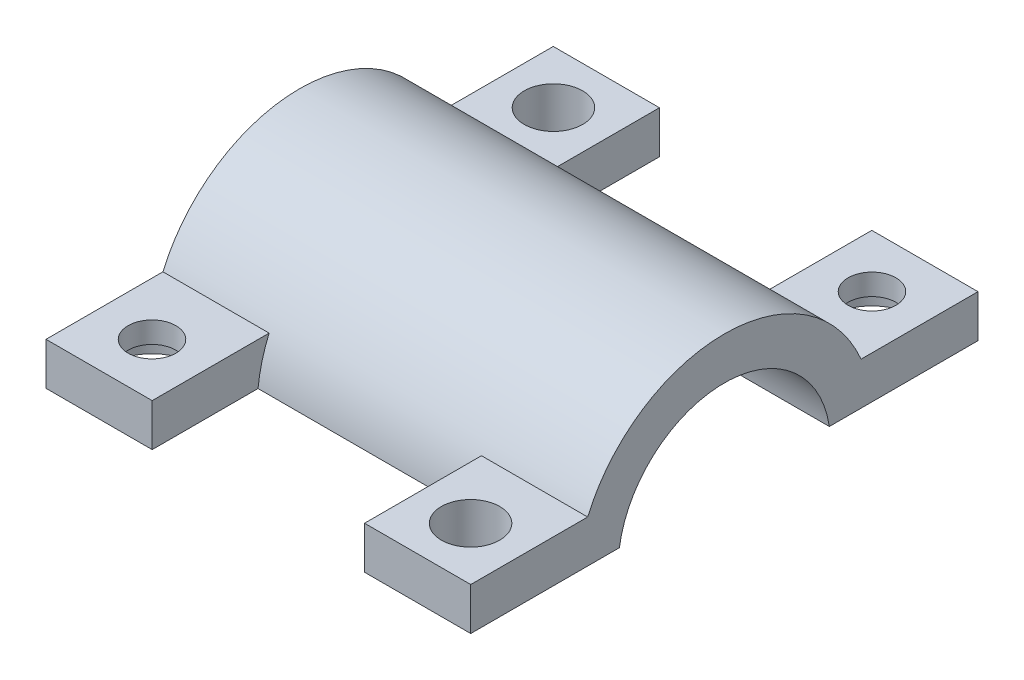
ISO-10303-21;
HEADER;
FILE_DESCRIPTION(('STEP AP214'),'2;1');
FILE_NAME('part.step','',(''),(''),'','','');
FILE_SCHEMA(('AUTOMOTIVE_DESIGN { 1 0 10303 214 1 1 1 1 }'));
ENDSEC;
DATA;
#1=APPLICATION_CONTEXT('core data for automotive mechanical design processes');
#2=APPLICATION_PROTOCOL_DEFINITION('international standard','automotive_design',2000,#1);
#3=PRODUCT_CONTEXT('',#1,'mechanical');
#4=PRODUCT('Part','Part','',(#3));
#5=PRODUCT_RELATED_PRODUCT_CATEGORY('part','',(#4));
#6=PRODUCT_DEFINITION_FORMATION('','',#4);
#7=PRODUCT_DEFINITION_CONTEXT('part definition',#1,'design');
#8=PRODUCT_DEFINITION('design','',#6,#7);
#9=PRODUCT_DEFINITION_SHAPE('','',#8);
#10=(LENGTH_UNIT() NAMED_UNIT(*) SI_UNIT(.MILLI.,.METRE.));
#11=(NAMED_UNIT(*) PLANE_ANGLE_UNIT() SI_UNIT($,.RADIAN.));
#12=(NAMED_UNIT(*) SI_UNIT($,.STERADIAN.) SOLID_ANGLE_UNIT());
#13=UNCERTAINTY_MEASURE_WITH_UNIT(LENGTH_MEASURE(1.E-05),#10,'distance_accuracy_value','');
#14=(GEOMETRIC_REPRESENTATION_CONTEXT(3) GLOBAL_UNCERTAINTY_ASSIGNED_CONTEXT((#13)) GLOBAL_UNIT_ASSIGNED_CONTEXT((#10,
#11,#12)) REPRESENTATION_CONTEXT('',''));
#15=CARTESIAN_POINT('',(0.,0.,0.));
#16=DIRECTION('',(0.,0.,1.));
#17=DIRECTION('',(1.,0.,0.));
#18=AXIS2_PLACEMENT_3D('',#15,#16,#17);
#19=CARTESIAN_POINT('',(-15.,5.5,18.9031354368588));
#20=DIRECTION('',(0.,-1.,0.));
#21=DIRECTION('',(0.,0.,-1.));
#22=AXIS2_PLACEMENT_3D('',#19,#20,#21);
#23=CYLINDRICAL_SURFACE('',#22,2.25);
#24=CARTESIAN_POINT('',(-15.,5.5,18.9031354368588));
#25=DIRECTION('',(0.,-1.,0.));
#26=DIRECTION('',(0.,0.,-1.));
#27=AXIS2_PLACEMENT_3D('',#24,#25,#26);
#28=CIRCLE('',#27,2.25);
#29=CARTESIAN_POINT('',(-15.,5.5,16.6531354368588));
#30=VERTEX_POINT('',#29);
#31=EDGE_CURVE('E200',#30,#30,#28,.T.);
#32=ORIENTED_EDGE('',*,*,#31,.F.);
#33=EDGE_LOOP('',(#32));
#34=FACE_BOUND('',#33,.T.);
#35=CARTESIAN_POINT('',(-15.,3.5,18.9031354368588));
#36=DIRECTION('',(0.,-1.,0.));
#37=DIRECTION('',(0.,0.,-1.));
#38=AXIS2_PLACEMENT_3D('',#35,#36,#37);
#39=CIRCLE('',#38,2.25);
#40=CARTESIAN_POINT('',(-15.,3.5,16.6531354368588));
#41=VERTEX_POINT('',#40);
#42=EDGE_CURVE('E43',#41,#41,#39,.F.);
#43=ORIENTED_EDGE('',*,*,#42,.F.);
#44=EDGE_LOOP('',(#43));
#45=FACE_BOUND('',#44,.T.);
#46=ADVANCED_FACE('F39',(#34,#45),#23,.F.);
#47=CARTESIAN_POINT('',(15.,5.5,-18.9031354368588));
#48=DIRECTION('',(0.,-1.,0.));
#49=DIRECTION('',(0.,0.,-1.));
#50=AXIS2_PLACEMENT_3D('',#47,#48,#49);
#51=CYLINDRICAL_SURFACE('',#50,2.25);
#52=CARTESIAN_POINT('',(15.,5.5,-18.9031354368588));
#53=DIRECTION('',(0.,-1.,0.));
#54=DIRECTION('',(0.,0.,-1.));
#55=AXIS2_PLACEMENT_3D('',#52,#53,#54);
#56=CIRCLE('',#55,2.25);
#57=CARTESIAN_POINT('',(15.,5.5,-21.1531354368588));
#58=VERTEX_POINT('',#57);
#59=EDGE_CURVE('E207',#58,#58,#56,.T.);
#60=ORIENTED_EDGE('',*,*,#59,.F.);
#61=EDGE_LOOP('',(#60));
#62=FACE_BOUND('',#61,.T.);
#63=CARTESIAN_POINT('',(15.,3.5,-18.9031354368588));
#64=DIRECTION('',(0.,-1.,0.));
#65=DIRECTION('',(0.,0.,-1.));
#66=AXIS2_PLACEMENT_3D('',#63,#64,#65);
#67=CIRCLE('',#66,2.25);
#68=CARTESIAN_POINT('',(15.,3.5,-21.1531354368588));
#69=VERTEX_POINT('',#68);
#70=EDGE_CURVE('E301',#69,#69,#67,.F.);
#71=ORIENTED_EDGE('',*,*,#70,.F.);
#72=EDGE_LOOP('',(#71));
#73=FACE_BOUND('',#72,.T.);
#74=ADVANCED_FACE('F382',(#62,#73),#51,.F.);
#75=CARTESIAN_POINT('',(20.,0.,0.));
#76=DIRECTION('',(-1.,0.,0.));
#77=DIRECTION('',(0.,0.,1.));
#78=AXIS2_PLACEMENT_3D('',#75,#76,#77);
#79=CYLINDRICAL_SURFACE('',#78,10.);
#80=CARTESIAN_POINT('',(-20.,0.,0.));
#81=DIRECTION('',(-1.,0.,0.));
#82=DIRECTION('',(0.,0.,-1.));
#83=AXIS2_PLACEMENT_3D('',#80,#81,#82);
#84=CIRCLE('',#83,10.);
#85=CARTESIAN_POINT('',(-20.,1.5,9.88685996664259));
#86=VERTEX_POINT('',#85);
#87=CARTESIAN_POINT('',(-20.,1.5,-9.88685996664259));
#88=VERTEX_POINT('',#87);
#89=EDGE_CURVE('E273',#86,#88,#84,.T.);
#90=ORIENTED_EDGE('',*,*,#89,.T.);
#91=DIRECTION('',(-1.,0.,0.));
#92=VECTOR('',#91,1.);
#93=CARTESIAN_POINT('',(20.,1.5,-9.88685996664259));
#94=LINE('',#93,#92);
#95=CARTESIAN_POINT('',(20.,1.5,-9.88685996664259));
#96=VERTEX_POINT('',#95);
#97=EDGE_CURVE('E299',#96,#88,#94,.T.);
#98=ORIENTED_EDGE('',*,*,#97,.F.);
#99=CARTESIAN_POINT('',(20.,0.,0.));
#100=DIRECTION('',(-1.,0.,0.));
#101=DIRECTION('',(0.,0.,-1.));
#102=AXIS2_PLACEMENT_3D('',#99,#100,#101);
#103=CIRCLE('',#102,10.);
#104=CARTESIAN_POINT('',(20.,1.5,9.88685996664259));
#105=VERTEX_POINT('',#104);
#106=EDGE_CURVE('E274',#105,#96,#103,.T.);
#107=ORIENTED_EDGE('',*,*,#106,.F.);
#108=DIRECTION('',(-1.,0.,0.));
#109=VECTOR('',#108,1.);
#110=CARTESIAN_POINT('',(20.,1.5,9.88685996664259));
#111=LINE('',#110,#109);
#112=EDGE_CURVE('E284',#105,#86,#111,.T.);
#113=ORIENTED_EDGE('',*,*,#112,.T.);
#114=EDGE_LOOP('',(#90,#98,#107,#113));
#115=FACE_BOUND('',#114,.T.);
#116=ADVANCED_FACE('F41',(#115),#79,.F.);
#117=CARTESIAN_POINT('',(20.,1.5,-9.88685996664259));
#118=DIRECTION('',(0.,1.,0.));
#119=DIRECTION('',(0.,0.,1.));
#120=AXIS2_PLACEMENT_3D('',#117,#118,#119);
#121=PLANE('',#120);
#122=CARTESIAN_POINT('',(15.,1.5,-18.9031354368588));
#123=DIRECTION('',(0.,-1.,0.));
#124=DIRECTION('',(0.,0.,-1.));
#125=AXIS2_PLACEMENT_3D('',#122,#123,#124);
#126=CIRCLE('',#125,4.);
#127=CARTESIAN_POINT('',(15.,1.5,-22.9031354368588));
#128=VERTEX_POINT('',#127);
#129=EDGE_CURVE('E313',#128,#128,#126,.T.);
#130=ORIENTED_EDGE('',*,*,#129,.F.);
#131=EDGE_LOOP('',(#130));
#132=FACE_BOUND('',#131,.T.);
#133=DIRECTION('',(-1.,0.,0.));
#134=VECTOR('',#133,1.);
#135=CARTESIAN_POINT('',(20.,1.5,-13.9194109070751));
#136=LINE('',#135,#134);
#137=CARTESIAN_POINT('',(10.,1.5,-13.9194109070751));
#138=VERTEX_POINT('',#137);
#139=CARTESIAN_POINT('',(-10.,1.5,-13.9194109070751));
#140=VERTEX_POINT('',#139);
#141=EDGE_CURVE('E297',#138,#140,#136,.T.);
#142=ORIENTED_EDGE('',*,*,#141,.F.);
#143=DIRECTION('',(0.,0.,-1.));
#144=VECTOR('',#143,1.);
#145=CARTESIAN_POINT('',(10.,1.5,-23.8868599666426));
#146=LINE('',#145,#144);
#147=CARTESIAN_POINT('',(10.,1.5,-23.8868599666426));
#148=VERTEX_POINT('',#147);
#149=EDGE_CURVE('E201',#138,#148,#146,.T.);
#150=ORIENTED_EDGE('',*,*,#149,.T.);
#151=DIRECTION('',(1.,0.,0.));
#152=VECTOR('',#151,1.);
#153=CARTESIAN_POINT('',(20.,1.5,-23.8868599666426));
#154=LINE('',#153,#152);
#155=CARTESIAN_POINT('',(20.,1.5,-23.8868599666426));
#156=VERTEX_POINT('',#155);
#157=EDGE_CURVE('E203',#148,#156,#154,.T.);
#158=ORIENTED_EDGE('',*,*,#157,.T.);
#159=DIRECTION('',(0.,0.,-1.));
#160=VECTOR('',#159,1.);
#161=CARTESIAN_POINT('',(20.,1.5,-9.88685996664259));
#162=LINE('',#161,#160);
#163=EDGE_CURVE('E277',#96,#156,#162,.T.);
#164=ORIENTED_EDGE('',*,*,#163,.F.);
#165=ORIENTED_EDGE('',*,*,#97,.T.);
#166=DIRECTION('',(0.,0.,-1.));
#167=VECTOR('',#166,1.);
#168=CARTESIAN_POINT('',(-20.,1.5,-9.88685996664259));
#169=LINE('',#168,#167);
#170=CARTESIAN_POINT('',(-20.,1.5,-23.8868599666426));
#171=VERTEX_POINT('',#170);
#172=EDGE_CURVE('E287',#88,#171,#169,.T.);
#173=ORIENTED_EDGE('',*,*,#172,.T.);
#174=DIRECTION('',(1.,0.,0.));
#175=VECTOR('',#174,1.);
#176=CARTESIAN_POINT('',(-20.,1.5,-23.8868599666426));
#177=LINE('',#176,#175);
#178=CARTESIAN_POINT('',(-10.,1.5,-23.8868599666426));
#179=VERTEX_POINT('',#178);
#180=EDGE_CURVE('E240',#171,#179,#177,.T.);
#181=ORIENTED_EDGE('',*,*,#180,.T.);
#182=DIRECTION('',(0.,0.,1.));
#183=VECTOR('',#182,1.);
#184=CARTESIAN_POINT('',(-10.,1.5,-23.8868599666426));
#185=LINE('',#184,#183);
#186=EDGE_CURVE('E246',#179,#140,#185,.T.);
#187=ORIENTED_EDGE('',*,*,#186,.T.);
#188=EDGE_LOOP('',(#142,#150,#158,#164,#165,#173,#181,#187));
#189=FACE_BOUND('',#188,.T.);
#190=CARTESIAN_POINT('',(-15.,1.5,-18.9031354368588));
#191=DIRECTION('',(0.,-1.,0.));
#192=DIRECTION('',(0.,0.,-1.));
#193=AXIS2_PLACEMENT_3D('',#190,#191,#192);
#194=CIRCLE('',#193,2.75);
#195=CARTESIAN_POINT('',(-15.,1.5,-21.6531354368588));
#196=VERTEX_POINT('',#195);
#197=EDGE_CURVE('E216',#196,#196,#194,.T.);
#198=ORIENTED_EDGE('',*,*,#197,.F.);
#199=EDGE_LOOP('',(#198));
#200=FACE_BOUND('',#199,.T.);
#201=ADVANCED_FACE('F362',(#132,#189,#200),#121,.F.);
#202=CARTESIAN_POINT('',(20.,0.,0.));
#203=DIRECTION('',(-1.,0.,0.));
#204=DIRECTION('',(0.,0.,1.));
#205=AXIS2_PLACEMENT_3D('',#202,#203,#204);
#206=CYLINDRICAL_SURFACE('',#205,14.);
#207=DIRECTION('',(-1.,0.,0.));
#208=VECTOR('',#207,1.);
#209=CARTESIAN_POINT('',(20.,5.5,-12.8743931895837));
#210=LINE('',#209,#208);
#211=CARTESIAN_POINT('',(20.,5.5,-12.8743931895837));
#212=VERTEX_POINT('',#211);
#213=CARTESIAN_POINT('',(10.,5.5,-12.8743931895837));
#214=VERTEX_POINT('',#213);
#215=EDGE_CURVE('E55',#212,#214,#210,.T.);
#216=ORIENTED_EDGE('',*,*,#215,.T.);
#217=CARTESIAN_POINT('',(10.,0.,0.));
#218=DIRECTION('',(-1.,0.,0.));
#219=DIRECTION('',(0.,0.,1.));
#220=AXIS2_PLACEMENT_3D('',#217,#218,#219);
#221=CIRCLE('',#220,14.);
#222=EDGE_CURVE('E11',#214,#138,#221,.T.);
#223=ORIENTED_EDGE('',*,*,#222,.T.);
#224=ORIENTED_EDGE('',*,*,#141,.T.);
#225=CARTESIAN_POINT('',(-10.,0.,0.));
#226=DIRECTION('',(1.,0.,0.));
#227=DIRECTION('',(0.,0.,-1.));
#228=AXIS2_PLACEMENT_3D('',#225,#226,#227);
#229=CIRCLE('',#228,14.);
#230=CARTESIAN_POINT('',(-10.,5.5,-12.8743931895837));
#231=VERTEX_POINT('',#230);
#232=EDGE_CURVE('E48',#140,#231,#229,.T.);
#233=ORIENTED_EDGE('',*,*,#232,.T.);
#234=DIRECTION('',(-1.,0.,0.));
#235=VECTOR('',#234,1.);
#236=CARTESIAN_POINT('',(20.,5.5,-12.8743931895837));
#237=LINE('',#236,#235);
#238=CARTESIAN_POINT('',(-20.,5.5,-12.8743931895837));
#239=VERTEX_POINT('',#238);
#240=EDGE_CURVE('E259',#239,#231,#237,.F.);
#241=ORIENTED_EDGE('',*,*,#240,.F.);
#242=CARTESIAN_POINT('',(-20.,0.,0.));
#243=DIRECTION('',(1.,0.,0.));
#244=DIRECTION('',(0.,0.,1.));
#245=AXIS2_PLACEMENT_3D('',#242,#243,#244);
#246=CIRCLE('',#245,14.);
#247=CARTESIAN_POINT('',(-20.,5.5,12.8743931895837));
#248=VERTEX_POINT('',#247);
#249=EDGE_CURVE('E289',#239,#248,#246,.T.);
#250=ORIENTED_EDGE('',*,*,#249,.T.);
#251=DIRECTION('',(-1.,0.,0.));
#252=VECTOR('',#251,1.);
#253=CARTESIAN_POINT('',(20.,5.5,12.8743931895837));
#254=LINE('',#253,#252);
#255=CARTESIAN_POINT('',(-10.,5.5,12.8743931895837));
#256=VERTEX_POINT('',#255);
#257=EDGE_CURVE('E263',#248,#256,#254,.F.);
#258=ORIENTED_EDGE('',*,*,#257,.T.);
#259=CARTESIAN_POINT('',(-10.,0.,0.));
#260=DIRECTION('',(1.,0.,0.));
#261=DIRECTION('',(0.,0.,-1.));
#262=AXIS2_PLACEMENT_3D('',#259,#260,#261);
#263=CIRCLE('',#262,14.);
#264=CARTESIAN_POINT('',(-10.,1.5,13.9194109070751));
#265=VERTEX_POINT('',#264);
#266=EDGE_CURVE('E270',#256,#265,#263,.T.);
#267=ORIENTED_EDGE('',*,*,#266,.T.);
#268=DIRECTION('',(-1.,0.,0.));
#269=VECTOR('',#268,1.);
#270=CARTESIAN_POINT('',(20.,1.5,13.9194109070751));
#271=LINE('',#270,#269);
#272=CARTESIAN_POINT('',(10.,1.5,13.9194109070751));
#273=VERTEX_POINT('',#272);
#274=EDGE_CURVE('E295',#273,#265,#271,.T.);
#275=ORIENTED_EDGE('',*,*,#274,.F.);
#276=CARTESIAN_POINT('',(10.,0.,0.));
#277=DIRECTION('',(-1.,0.,0.));
#278=DIRECTION('',(0.,0.,1.));
#279=AXIS2_PLACEMENT_3D('',#276,#277,#278);
#280=CIRCLE('',#279,14.);
#281=CARTESIAN_POINT('',(10.,5.5,12.8743931895837));
#282=VERTEX_POINT('',#281);
#283=EDGE_CURVE('E169',#273,#282,#280,.T.);
#284=ORIENTED_EDGE('',*,*,#283,.T.);
#285=DIRECTION('',(-1.,0.,0.));
#286=VECTOR('',#285,1.);
#287=CARTESIAN_POINT('',(20.,5.5,12.8743931895837));
#288=LINE('',#287,#286);
#289=CARTESIAN_POINT('',(20.,5.5,12.8743931895837));
#290=VERTEX_POINT('',#289);
#291=EDGE_CURVE('E266',#290,#282,#288,.T.);
#292=ORIENTED_EDGE('',*,*,#291,.F.);
#293=CARTESIAN_POINT('',(20.,0.,0.));
#294=DIRECTION('',(1.,0.,0.));
#295=DIRECTION('',(0.,0.,1.));
#296=AXIS2_PLACEMENT_3D('',#293,#294,#295);
#297=CIRCLE('',#296,14.);
#298=EDGE_CURVE('E280',#212,#290,#297,.T.);
#299=ORIENTED_EDGE('',*,*,#298,.F.);
#300=EDGE_LOOP('',(#216,#223,#224,#233,#241,#250,#258,#267,#275,#284,#292,#299));
#301=FACE_BOUND('',#300,.T.);
#302=ADVANCED_FACE('F326',(#301),#206,.T.);
#303=CARTESIAN_POINT('',(20.,1.5,13.9194109070751));
#304=DIRECTION('',(0.,1.,0.));
#305=DIRECTION('',(0.,0.,1.));
#306=AXIS2_PLACEMENT_3D('',#303,#304,#305);
#307=PLANE('',#306);
#308=CARTESIAN_POINT('',(-15.,1.5,18.9031354368588));
#309=DIRECTION('',(0.,-1.,0.));
#310=DIRECTION('',(0.,0.,-1.));
#311=AXIS2_PLACEMENT_3D('',#308,#309,#310);
#312=CIRCLE('',#311,4.);
#313=CARTESIAN_POINT('',(-15.,1.5,14.9031354368588));
#314=VERTEX_POINT('',#313);
#315=EDGE_CURVE('E308',#314,#314,#312,.T.);
#316=ORIENTED_EDGE('',*,*,#315,.F.);
#317=EDGE_LOOP('',(#316));
#318=FACE_BOUND('',#317,.T.);
#319=ORIENTED_EDGE('',*,*,#274,.T.);
#320=DIRECTION('',(0.,0.,1.));
#321=VECTOR('',#320,1.);
#322=CARTESIAN_POINT('',(-10.,1.5,23.8868599666426));
#323=LINE('',#322,#321);
#324=CARTESIAN_POINT('',(-10.,1.5,23.8868599666426));
#325=VERTEX_POINT('',#324);
#326=EDGE_CURVE('E223',#265,#325,#323,.T.);
#327=ORIENTED_EDGE('',*,*,#326,.T.);
#328=DIRECTION('',(-1.,0.,0.));
#329=VECTOR('',#328,1.);
#330=CARTESIAN_POINT('',(-20.,1.5,23.8868599666426));
#331=LINE('',#330,#329);
#332=CARTESIAN_POINT('',(-20.,1.5,23.8868599666426));
#333=VERTEX_POINT('',#332);
#334=EDGE_CURVE('E225',#325,#333,#331,.T.);
#335=ORIENTED_EDGE('',*,*,#334,.T.);
#336=DIRECTION('',(0.,0.,-1.));
#337=VECTOR('',#336,1.);
#338=CARTESIAN_POINT('',(-20.,1.5,13.9194109070751));
#339=LINE('',#338,#337);
#340=EDGE_CURVE('E278',#333,#86,#339,.T.);
#341=ORIENTED_EDGE('',*,*,#340,.T.);
#342=ORIENTED_EDGE('',*,*,#112,.F.);
#343=DIRECTION('',(0.,0.,-1.));
#344=VECTOR('',#343,1.);
#345=CARTESIAN_POINT('',(20.,1.5,13.9194109070751));
#346=LINE('',#345,#344);
#347=CARTESIAN_POINT('',(20.,1.5,23.8868599666426));
#348=VERTEX_POINT('',#347);
#349=EDGE_CURVE('E178',#348,#105,#346,.T.);
#350=ORIENTED_EDGE('',*,*,#349,.F.);
#351=DIRECTION('',(-1.,0.,0.));
#352=VECTOR('',#351,1.);
#353=CARTESIAN_POINT('',(20.,1.5,23.8868599666426));
#354=LINE('',#353,#352);
#355=CARTESIAN_POINT('',(10.,1.5,23.8868599666426));
#356=VERTEX_POINT('',#355);
#357=EDGE_CURVE('E157',#348,#356,#354,.T.);
#358=ORIENTED_EDGE('',*,*,#357,.T.);
#359=DIRECTION('',(0.,0.,-1.));
#360=VECTOR('',#359,1.);
#361=CARTESIAN_POINT('',(10.,1.5,23.8868599666426));
#362=LINE('',#361,#360);
#363=EDGE_CURVE('E166',#356,#273,#362,.T.);
#364=ORIENTED_EDGE('',*,*,#363,.T.);
#365=EDGE_LOOP('',(#319,#327,#335,#341,#342,#350,#358,#364));
#366=FACE_BOUND('',#365,.T.);
#367=CARTESIAN_POINT('',(15.,1.5,18.9031354368588));
#368=DIRECTION('',(0.,-1.,0.));
#369=DIRECTION('',(0.,0.,-1.));
#370=AXIS2_PLACEMENT_3D('',#367,#368,#369);
#371=CIRCLE('',#370,2.75);
#372=CARTESIAN_POINT('',(15.,1.5,16.1531354368588));
#373=VERTEX_POINT('',#372);
#374=EDGE_CURVE('E183',#373,#373,#371,.T.);
#375=ORIENTED_EDGE('',*,*,#374,.F.);
#376=EDGE_LOOP('',(#375));
#377=FACE_BOUND('',#376,.T.);
#378=ADVANCED_FACE('F175',(#318,#366,#377),#307,.F.);
#379=CARTESIAN_POINT('',(20.,0.,0.));
#380=DIRECTION('',(1.,0.,0.));
#381=DIRECTION('',(0.,0.,-1.));
#382=AXIS2_PLACEMENT_3D('',#379,#380,#381);
#383=PLANE('',#382);
#384=ORIENTED_EDGE('',*,*,#106,.T.);
#385=ORIENTED_EDGE('',*,*,#163,.T.);
#386=DIRECTION('',(0.,-1.,0.));
#387=VECTOR('',#386,1.);
#388=CARTESIAN_POINT('',(20.,5.5,-23.8868599666426));
#389=LINE('',#388,#387);
#390=CARTESIAN_POINT('',(20.,5.5,-23.8868599666426));
#391=VERTEX_POINT('',#390);
#392=EDGE_CURVE('E193',#391,#156,#389,.T.);
#393=ORIENTED_EDGE('',*,*,#392,.F.);
#394=DIRECTION('',(0.,0.,1.));
#395=VECTOR('',#394,1.);
#396=CARTESIAN_POINT('',(20.,5.5,-9.88685996664259));
#397=LINE('',#396,#395);
#398=EDGE_CURVE('E209',#391,#212,#397,.T.);
#399=ORIENTED_EDGE('',*,*,#398,.T.);
#400=ORIENTED_EDGE('',*,*,#298,.T.);
#401=DIRECTION('',(0.,0.,1.));
#402=VECTOR('',#401,1.);
#403=CARTESIAN_POINT('',(20.,5.5,9.88685996664259));
#404=LINE('',#403,#402);
#405=CARTESIAN_POINT('',(20.,5.5,23.8868599666426));
#406=VERTEX_POINT('',#405);
#407=EDGE_CURVE('E173',#290,#406,#404,.T.);
#408=ORIENTED_EDGE('',*,*,#407,.T.);
#409=DIRECTION('',(0.,-1.,0.));
#410=VECTOR('',#409,1.);
#411=CARTESIAN_POINT('',(20.,5.5,23.8868599666426));
#412=LINE('',#411,#410);
#413=EDGE_CURVE('E163',#406,#348,#412,.T.);
#414=ORIENTED_EDGE('',*,*,#413,.T.);
#415=ORIENTED_EDGE('',*,*,#349,.T.);
#416=EDGE_LOOP('',(#384,#385,#393,#399,#400,#408,#414,#415));
#417=FACE_BOUND('',#416,.T.);
#418=ADVANCED_FACE('F322',(#417),#383,.T.);
#419=CARTESIAN_POINT('',(-20.,0.,0.));
#420=DIRECTION('',(1.,0.,0.));
#421=DIRECTION('',(0.,0.,-1.));
#422=AXIS2_PLACEMENT_3D('',#419,#420,#421);
#423=PLANE('',#422);
#424=ORIENTED_EDGE('',*,*,#172,.F.);
#425=ORIENTED_EDGE('',*,*,#89,.F.);
#426=ORIENTED_EDGE('',*,*,#340,.F.);
#427=DIRECTION('',(0.,-1.,0.));
#428=VECTOR('',#427,1.);
#429=CARTESIAN_POINT('',(-20.,5.5,23.8868599666426));
#430=LINE('',#429,#428);
#431=CARTESIAN_POINT('',(-20.,5.5,23.8868599666426));
#432=VERTEX_POINT('',#431);
#433=EDGE_CURVE('E217',#432,#333,#430,.T.);
#434=ORIENTED_EDGE('',*,*,#433,.F.);
#435=DIRECTION('',(0.,0.,-1.));
#436=VECTOR('',#435,1.);
#437=CARTESIAN_POINT('',(-20.,5.5,9.88685996664259));
#438=LINE('',#437,#436);
#439=EDGE_CURVE('E230',#432,#248,#438,.T.);
#440=ORIENTED_EDGE('',*,*,#439,.T.);
#441=ORIENTED_EDGE('',*,*,#249,.F.);
#442=DIRECTION('',(0.,0.,-1.));
#443=VECTOR('',#442,1.);
#444=CARTESIAN_POINT('',(-20.,5.5,-9.88685996664259));
#445=LINE('',#444,#443);
#446=CARTESIAN_POINT('',(-20.,5.5,-23.8868599666426));
#447=VERTEX_POINT('',#446);
#448=EDGE_CURVE('E243',#239,#447,#445,.T.);
#449=ORIENTED_EDGE('',*,*,#448,.T.);
#450=DIRECTION('',(0.,-1.,0.));
#451=VECTOR('',#450,1.);
#452=CARTESIAN_POINT('',(-20.,5.5,-23.8868599666426));
#453=LINE('',#452,#451);
#454=EDGE_CURVE('E252',#447,#171,#453,.T.);
#455=ORIENTED_EDGE('',*,*,#454,.T.);
#456=EDGE_LOOP('',(#424,#425,#426,#434,#440,#441,#449,#455));
#457=FACE_BOUND('',#456,.T.);
#458=ADVANCED_FACE('F338',(#457),#423,.F.);
#459=CARTESIAN_POINT('',(0.,5.5,0.));
#460=DIRECTION('',(0.,-1.,0.));
#461=DIRECTION('',(0.,0.,-1.));
#462=AXIS2_PLACEMENT_3D('',#459,#460,#461);
#463=PLANE('',#462);
#464=CARTESIAN_POINT('',(-15.,5.5,-18.9031354368588));
#465=DIRECTION('',(0.,-1.,0.));
#466=DIRECTION('',(0.,0.,-1.));
#467=AXIS2_PLACEMENT_3D('',#464,#465,#466);
#468=CIRCLE('',#467,2.75);
#469=CARTESIAN_POINT('',(-15.,5.5,-21.6531354368588));
#470=VERTEX_POINT('',#469);
#471=EDGE_CURVE('E237',#470,#470,#468,.T.);
#472=ORIENTED_EDGE('',*,*,#471,.T.);
#473=EDGE_LOOP('',(#472));
#474=FACE_BOUND('',#473,.T.);
#475=ORIENTED_EDGE('',*,*,#448,.F.);
#476=ORIENTED_EDGE('',*,*,#240,.T.);
#477=DIRECTION('',(0.,0.,1.));
#478=VECTOR('',#477,1.);
#479=CARTESIAN_POINT('',(-10.,5.5,-23.8868599666426));
#480=LINE('',#479,#478);
#481=CARTESIAN_POINT('',(-10.,5.5,-23.8868599666426));
#482=VERTEX_POINT('',#481);
#483=EDGE_CURVE('E249',#482,#231,#480,.T.);
#484=ORIENTED_EDGE('',*,*,#483,.F.);
#485=DIRECTION('',(1.,0.,0.));
#486=VECTOR('',#485,1.);
#487=CARTESIAN_POINT('',(-20.,5.5,-23.8868599666426));
#488=LINE('',#487,#486);
#489=EDGE_CURVE('E245',#447,#482,#488,.T.);
#490=ORIENTED_EDGE('',*,*,#489,.F.);
#491=EDGE_LOOP('',(#475,#476,#484,#490));
#492=FACE_BOUND('',#491,.T.);
#493=ADVANCED_FACE('F347',(#474,#492),#463,.F.);
#494=CARTESIAN_POINT('',(-10.,5.5,-23.8868599666426));
#495=DIRECTION('',(1.,0.,0.));
#496=DIRECTION('',(0.,0.,-1.));
#497=AXIS2_PLACEMENT_3D('',#494,#495,#496);
#498=PLANE('',#497);
#499=ORIENTED_EDGE('',*,*,#232,.F.);
#500=ORIENTED_EDGE('',*,*,#186,.F.);
#501=DIRECTION('',(0.,-1.,0.));
#502=VECTOR('',#501,1.);
#503=CARTESIAN_POINT('',(-10.,5.5,-23.8868599666426));
#504=LINE('',#503,#502);
#505=EDGE_CURVE('E257',#482,#179,#504,.T.);
#506=ORIENTED_EDGE('',*,*,#505,.F.);
#507=ORIENTED_EDGE('',*,*,#483,.T.);
#508=EDGE_LOOP('',(#499,#500,#506,#507));
#509=FACE_BOUND('',#508,.T.);
#510=ADVANCED_FACE('F401',(#509),#498,.T.);
#511=CARTESIAN_POINT('',(-20.,5.5,-23.8868599666426));
#512=DIRECTION('',(0.,0.,-1.));
#513=DIRECTION('',(-1.,0.,0.));
#514=AXIS2_PLACEMENT_3D('',#511,#512,#513);
#515=PLANE('',#514);
#516=ORIENTED_EDGE('',*,*,#180,.F.);
#517=ORIENTED_EDGE('',*,*,#454,.F.);
#518=ORIENTED_EDGE('',*,*,#489,.T.);
#519=ORIENTED_EDGE('',*,*,#505,.T.);
#520=EDGE_LOOP('',(#516,#517,#518,#519));
#521=FACE_BOUND('',#520,.T.);
#522=ADVANCED_FACE('F351',(#521),#515,.T.);
#523=CARTESIAN_POINT('',(-15.,5.5,-18.9031354368588));
#524=DIRECTION('',(0.,-1.,0.));
#525=DIRECTION('',(0.,0.,-1.));
#526=AXIS2_PLACEMENT_3D('',#523,#524,#525);
#527=CYLINDRICAL_SURFACE('',#526,2.75);
#528=ORIENTED_EDGE('',*,*,#471,.F.);
#529=EDGE_LOOP('',(#528));
#530=FACE_BOUND('',#529,.T.);
#531=ORIENTED_EDGE('',*,*,#197,.T.);
#532=EDGE_LOOP('',(#531));
#533=FACE_BOUND('',#532,.T.);
#534=ADVANCED_FACE('F395',(#530,#533),#527,.F.);
#535=CARTESIAN_POINT('',(10.,5.5,23.8868599666426));
#536=DIRECTION('',(-1.,0.,0.));
#537=DIRECTION('',(0.,0.,1.));
#538=AXIS2_PLACEMENT_3D('',#535,#536,#537);
#539=PLANE('',#538);
#540=ORIENTED_EDGE('',*,*,#283,.F.);
#541=ORIENTED_EDGE('',*,*,#363,.F.);
#542=DIRECTION('',(0.,-1.,0.));
#543=VECTOR('',#542,1.);
#544=CARTESIAN_POINT('',(10.,5.5,23.8868599666426));
#545=LINE('',#544,#543);
#546=CARTESIAN_POINT('',(10.,5.5,23.8868599666426));
#547=VERTEX_POINT('',#546);
#548=EDGE_CURVE('E152',#547,#356,#545,.T.);
#549=ORIENTED_EDGE('',*,*,#548,.F.);
#550=DIRECTION('',(0.,0.,-1.));
#551=VECTOR('',#550,1.);
#552=CARTESIAN_POINT('',(10.,5.5,23.8868599666426));
#553=LINE('',#552,#551);
#554=EDGE_CURVE('E186',#547,#282,#553,.T.);
#555=ORIENTED_EDGE('',*,*,#554,.T.);
#556=EDGE_LOOP('',(#540,#541,#549,#555));
#557=FACE_BOUND('',#556,.T.);
#558=ADVANCED_FACE('F167',(#557),#539,.T.);
#559=CARTESIAN_POINT('',(0.,5.5,0.));
#560=DIRECTION('',(0.,-1.,0.));
#561=DIRECTION('',(0.,0.,-1.));
#562=AXIS2_PLACEMENT_3D('',#559,#560,#561);
#563=PLANE('',#562);
#564=CARTESIAN_POINT('',(15.,5.5,18.9031354368588));
#565=DIRECTION('',(0.,-1.,0.));
#566=DIRECTION('',(0.,0.,-1.));
#567=AXIS2_PLACEMENT_3D('',#564,#565,#566);
#568=CIRCLE('',#567,2.75);
#569=CARTESIAN_POINT('',(15.,5.5,16.1531354368588));
#570=VERTEX_POINT('',#569);
#571=EDGE_CURVE('E180',#570,#570,#568,.T.);
#572=ORIENTED_EDGE('',*,*,#571,.T.);
#573=EDGE_LOOP('',(#572));
#574=FACE_BOUND('',#573,.T.);
#575=ORIENTED_EDGE('',*,*,#407,.F.);
#576=ORIENTED_EDGE('',*,*,#291,.T.);
#577=ORIENTED_EDGE('',*,*,#554,.F.);
#578=DIRECTION('',(-1.,0.,0.));
#579=VECTOR('',#578,1.);
#580=CARTESIAN_POINT('',(20.,5.5,23.8868599666426));
#581=LINE('',#580,#579);
#582=EDGE_CURVE('E159',#406,#547,#581,.T.);
#583=ORIENTED_EDGE('',*,*,#582,.F.);
#584=EDGE_LOOP('',(#575,#576,#577,#583));
#585=FACE_BOUND('',#584,.T.);
#586=ADVANCED_FACE('F324',(#574,#585),#563,.F.);
#587=CARTESIAN_POINT('',(20.,5.5,23.8868599666426));
#588=DIRECTION('',(0.,0.,1.));
#589=DIRECTION('',(1.,0.,0.));
#590=AXIS2_PLACEMENT_3D('',#587,#588,#589);
#591=PLANE('',#590);
#592=ORIENTED_EDGE('',*,*,#357,.F.);
#593=ORIENTED_EDGE('',*,*,#413,.F.);
#594=ORIENTED_EDGE('',*,*,#582,.T.);
#595=ORIENTED_EDGE('',*,*,#548,.T.);
#596=EDGE_LOOP('',(#592,#593,#594,#595));
#597=FACE_BOUND('',#596,.T.);
#598=ADVANCED_FACE('F154',(#597),#591,.T.);
#599=CARTESIAN_POINT('',(15.,5.5,18.9031354368588));
#600=DIRECTION('',(0.,-1.,0.));
#601=DIRECTION('',(0.,0.,-1.));
#602=AXIS2_PLACEMENT_3D('',#599,#600,#601);
#603=CYLINDRICAL_SURFACE('',#602,2.75);
#604=ORIENTED_EDGE('',*,*,#571,.F.);
#605=EDGE_LOOP('',(#604));
#606=FACE_BOUND('',#605,.T.);
#607=ORIENTED_EDGE('',*,*,#374,.T.);
#608=EDGE_LOOP('',(#607));
#609=FACE_BOUND('',#608,.T.);
#610=ADVANCED_FACE('F442',(#606,#609),#603,.F.);
#611=CARTESIAN_POINT('',(-10.,5.5,23.8868599666426));
#612=DIRECTION('',(1.,0.,0.));
#613=DIRECTION('',(0.,0.,-1.));
#614=AXIS2_PLACEMENT_3D('',#611,#612,#613);
#615=PLANE('',#614);
#616=ORIENTED_EDGE('',*,*,#266,.F.);
#617=DIRECTION('',(0.,0.,1.));
#618=VECTOR('',#617,1.);
#619=CARTESIAN_POINT('',(-10.,5.5,23.8868599666426));
#620=LINE('',#619,#618);
#621=CARTESIAN_POINT('',(-10.,5.5,23.8868599666426));
#622=VERTEX_POINT('',#621);
#623=EDGE_CURVE('E220',#256,#622,#620,.T.);
#624=ORIENTED_EDGE('',*,*,#623,.T.);
#625=DIRECTION('',(0.,-1.,0.));
#626=VECTOR('',#625,1.);
#627=CARTESIAN_POINT('',(-10.,5.5,23.8868599666426));
#628=LINE('',#627,#626);
#629=EDGE_CURVE('E191',#622,#325,#628,.T.);
#630=ORIENTED_EDGE('',*,*,#629,.T.);
#631=ORIENTED_EDGE('',*,*,#326,.F.);
#632=EDGE_LOOP('',(#616,#624,#630,#631));
#633=FACE_BOUND('',#632,.T.);
#634=ADVANCED_FACE('F330',(#633),#615,.T.);
#635=CARTESIAN_POINT('',(0.,5.5,0.));
#636=DIRECTION('',(0.,1.,0.));
#637=DIRECTION('',(0.,0.,1.));
#638=AXIS2_PLACEMENT_3D('',#635,#636,#637);
#639=PLANE('',#638);
#640=ORIENTED_EDGE('',*,*,#31,.T.);
#641=EDGE_LOOP('',(#640));
#642=FACE_BOUND('',#641,.T.);
#643=ORIENTED_EDGE('',*,*,#257,.F.);
#644=ORIENTED_EDGE('',*,*,#439,.F.);
#645=DIRECTION('',(-1.,0.,0.));
#646=VECTOR('',#645,1.);
#647=CARTESIAN_POINT('',(-20.,5.5,23.8868599666426));
#648=LINE('',#647,#646);
#649=EDGE_CURVE('E226',#622,#432,#648,.T.);
#650=ORIENTED_EDGE('',*,*,#649,.F.);
#651=ORIENTED_EDGE('',*,*,#623,.F.);
#652=EDGE_LOOP('',(#643,#644,#650,#651));
#653=FACE_BOUND('',#652,.T.);
#654=ADVANCED_FACE('F342',(#642,#653),#639,.T.);
#655=CARTESIAN_POINT('',(-20.,5.5,23.8868599666426));
#656=DIRECTION('',(0.,0.,1.));
#657=DIRECTION('',(1.,0.,0.));
#658=AXIS2_PLACEMENT_3D('',#655,#656,#657);
#659=PLANE('',#658);
#660=ORIENTED_EDGE('',*,*,#334,.F.);
#661=ORIENTED_EDGE('',*,*,#629,.F.);
#662=ORIENTED_EDGE('',*,*,#649,.T.);
#663=ORIENTED_EDGE('',*,*,#433,.T.);
#664=EDGE_LOOP('',(#660,#661,#662,#663));
#665=FACE_BOUND('',#664,.T.);
#666=ADVANCED_FACE('F334',(#665),#659,.T.);
#667=CARTESIAN_POINT('',(0.,5.5,0.));
#668=DIRECTION('',(0.,1.,0.));
#669=DIRECTION('',(0.,0.,1.));
#670=AXIS2_PLACEMENT_3D('',#667,#668,#669);
#671=PLANE('',#670);
#672=ORIENTED_EDGE('',*,*,#59,.T.);
#673=EDGE_LOOP('',(#672));
#674=FACE_BOUND('',#673,.T.);
#675=ORIENTED_EDGE('',*,*,#215,.F.);
#676=ORIENTED_EDGE('',*,*,#398,.F.);
#677=DIRECTION('',(1.,0.,0.));
#678=VECTOR('',#677,1.);
#679=CARTESIAN_POINT('',(20.,5.5,-23.8868599666426));
#680=LINE('',#679,#678);
#681=CARTESIAN_POINT('',(10.,5.5,-23.8868599666426));
#682=VERTEX_POINT('',#681);
#683=EDGE_CURVE('E204',#682,#391,#680,.T.);
#684=ORIENTED_EDGE('',*,*,#683,.F.);
#685=DIRECTION('',(0.,0.,-1.));
#686=VECTOR('',#685,1.);
#687=CARTESIAN_POINT('',(10.,5.5,-23.8868599666426));
#688=LINE('',#687,#686);
#689=EDGE_CURVE('E196',#214,#682,#688,.T.);
#690=ORIENTED_EDGE('',*,*,#689,.F.);
#691=EDGE_LOOP('',(#675,#676,#684,#690));
#692=FACE_BOUND('',#691,.T.);
#693=ADVANCED_FACE('F369',(#674,#692),#671,.T.);
#694=CARTESIAN_POINT('',(20.,5.5,-23.8868599666426));
#695=DIRECTION('',(0.,0.,-1.));
#696=DIRECTION('',(-1.,0.,0.));
#697=AXIS2_PLACEMENT_3D('',#694,#695,#696);
#698=PLANE('',#697);
#699=ORIENTED_EDGE('',*,*,#157,.F.);
#700=DIRECTION('',(0.,-1.,0.));
#701=VECTOR('',#700,1.);
#702=CARTESIAN_POINT('',(10.,5.5,-23.8868599666426));
#703=LINE('',#702,#701);
#704=EDGE_CURVE('E197',#682,#148,#703,.T.);
#705=ORIENTED_EDGE('',*,*,#704,.F.);
#706=ORIENTED_EDGE('',*,*,#683,.T.);
#707=ORIENTED_EDGE('',*,*,#392,.T.);
#708=EDGE_LOOP('',(#699,#705,#706,#707));
#709=FACE_BOUND('',#708,.T.);
#710=ADVANCED_FACE('F359',(#709),#698,.T.);
#711=CARTESIAN_POINT('',(10.,5.5,-23.8868599666426));
#712=DIRECTION('',(-1.,0.,0.));
#713=DIRECTION('',(0.,0.,1.));
#714=AXIS2_PLACEMENT_3D('',#711,#712,#713);
#715=PLANE('',#714);
#716=ORIENTED_EDGE('',*,*,#222,.F.);
#717=ORIENTED_EDGE('',*,*,#689,.T.);
#718=ORIENTED_EDGE('',*,*,#704,.T.);
#719=ORIENTED_EDGE('',*,*,#149,.F.);
#720=EDGE_LOOP('',(#716,#717,#718,#719));
#721=FACE_BOUND('',#720,.T.);
#722=ADVANCED_FACE('F366',(#721),#715,.T.);
#723=CARTESIAN_POINT('',(15.,3.5,-18.9031354368588));
#724=DIRECTION('',(0.,-1.,0.));
#725=DIRECTION('',(0.,0.,-1.));
#726=AXIS2_PLACEMENT_3D('',#723,#724,#725);
#727=PLANE('',#726);
#728=CARTESIAN_POINT('',(15.,3.5,-18.9031354368588));
#729=DIRECTION('',(0.,-1.,0.));
#730=DIRECTION('',(0.,0.,-1.));
#731=AXIS2_PLACEMENT_3D('',#728,#729,#730);
#732=CIRCLE('',#731,4.);
#733=CARTESIAN_POINT('',(15.,3.5,-22.9031354368588));
#734=VERTEX_POINT('',#733);
#735=EDGE_CURVE('E318',#734,#734,#732,.T.);
#736=ORIENTED_EDGE('',*,*,#735,.T.);
#737=EDGE_LOOP('',(#736));
#738=FACE_BOUND('',#737,.T.);
#739=ORIENTED_EDGE('',*,*,#70,.T.);
#740=EDGE_LOOP('',(#739));
#741=FACE_BOUND('',#740,.T.);
#742=ADVANCED_FACE('F426',(#738,#741),#727,.T.);
#743=CARTESIAN_POINT('',(15.,3.5,-18.9031354368588));
#744=DIRECTION('',(0.,-1.,0.));
#745=DIRECTION('',(0.,0.,-1.));
#746=AXIS2_PLACEMENT_3D('',#743,#744,#745);
#747=CYLINDRICAL_SURFACE('',#746,4.);
#748=ORIENTED_EDGE('',*,*,#735,.F.);
#749=EDGE_LOOP('',(#748));
#750=FACE_BOUND('',#749,.T.);
#751=ORIENTED_EDGE('',*,*,#129,.T.);
#752=EDGE_LOOP('',(#751));
#753=FACE_BOUND('',#752,.T.);
#754=ADVANCED_FACE('F423',(#750,#753),#747,.F.);
#755=CARTESIAN_POINT('',(-15.,3.5,18.9031354368588));
#756=DIRECTION('',(0.,-1.,0.));
#757=DIRECTION('',(0.,0.,-1.));
#758=AXIS2_PLACEMENT_3D('',#755,#756,#757);
#759=PLANE('',#758);
#760=CARTESIAN_POINT('',(-15.,3.5,18.9031354368588));
#761=DIRECTION('',(0.,-1.,0.));
#762=DIRECTION('',(0.,0.,-1.));
#763=AXIS2_PLACEMENT_3D('',#760,#761,#762);
#764=CIRCLE('',#763,4.);
#765=CARTESIAN_POINT('',(-15.,3.5,14.9031354368588));
#766=VERTEX_POINT('',#765);
#767=EDGE_CURVE('E303',#766,#766,#764,.T.);
#768=ORIENTED_EDGE('',*,*,#767,.T.);
#769=EDGE_LOOP('',(#768));
#770=FACE_BOUND('',#769,.T.);
#771=ORIENTED_EDGE('',*,*,#42,.T.);
#772=EDGE_LOOP('',(#771));
#773=FACE_BOUND('',#772,.T.);
#774=ADVANCED_FACE('F425',(#770,#773),#759,.T.);
#775=CARTESIAN_POINT('',(-15.,3.5,18.9031354368588));
#776=DIRECTION('',(0.,-1.,0.));
#777=DIRECTION('',(0.,0.,-1.));
#778=AXIS2_PLACEMENT_3D('',#775,#776,#777);
#779=CYLINDRICAL_SURFACE('',#778,4.);
#780=ORIENTED_EDGE('',*,*,#767,.F.);
#781=EDGE_LOOP('',(#780));
#782=FACE_BOUND('',#781,.T.);
#783=ORIENTED_EDGE('',*,*,#315,.T.);
#784=EDGE_LOOP('',(#783));
#785=FACE_BOUND('',#784,.T.);
#786=ADVANCED_FACE('F433',(#782,#785),#779,.F.);
#787=CLOSED_SHELL('',(#46,#74,#116,#201,#302,#378,#418,#458,#493,#510,#522,#534,#558,#586,#598,
#610,#634,#654,#666,#693,#710,#722,#742,#754,#774,#786));
#788=MANIFOLD_SOLID_BREP('B2',#787);
#789=ADVANCED_BREP_SHAPE_REPRESENTATION('',(#18,#788),#14);
#790=SHAPE_DEFINITION_REPRESENTATION(#9,#789);
ENDSEC;
END-ISO-10303-21;
